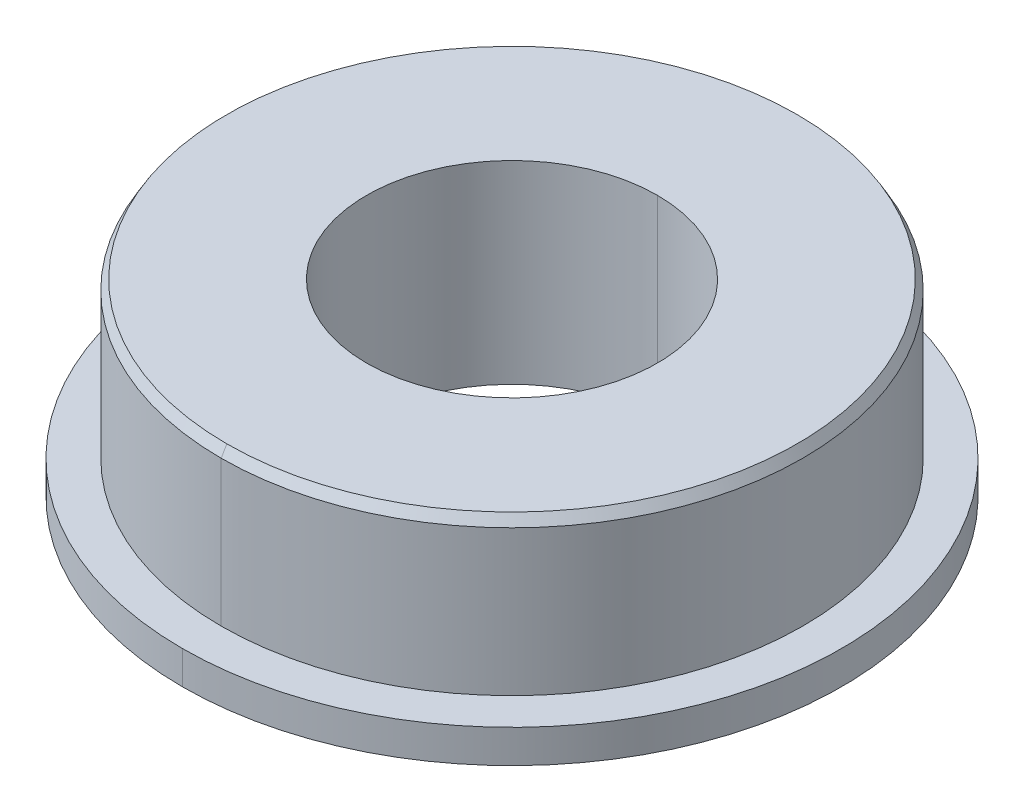
ISO-10303-21;
HEADER;
FILE_DESCRIPTION(('STEP AP214'),'2;1');
FILE_NAME('part.step','',(''),(''),'','','');
FILE_SCHEMA(('AUTOMOTIVE_DESIGN { 1 0 10303 214 1 1 1 1 }'));
ENDSEC;
DATA;
#1=APPLICATION_CONTEXT('core data for automotive mechanical design processes');
#2=APPLICATION_PROTOCOL_DEFINITION('international standard','automotive_design',2000,#1);
#3=PRODUCT_CONTEXT('',#1,'mechanical');
#4=PRODUCT('Part','Part','',(#3));
#5=PRODUCT_RELATED_PRODUCT_CATEGORY('part','',(#4));
#6=PRODUCT_DEFINITION_FORMATION('','',#4);
#7=PRODUCT_DEFINITION_CONTEXT('part definition',#1,'design');
#8=PRODUCT_DEFINITION('design','',#6,#7);
#9=PRODUCT_DEFINITION_SHAPE('','',#8);
#10=(LENGTH_UNIT() NAMED_UNIT(*) SI_UNIT(.MILLI.,.METRE.));
#11=(NAMED_UNIT(*) PLANE_ANGLE_UNIT() SI_UNIT($,.RADIAN.));
#12=(NAMED_UNIT(*) SI_UNIT($,.STERADIAN.) SOLID_ANGLE_UNIT());
#13=UNCERTAINTY_MEASURE_WITH_UNIT(LENGTH_MEASURE(1.E-05),#10,'distance_accuracy_value','');
#14=(GEOMETRIC_REPRESENTATION_CONTEXT(3) GLOBAL_UNCERTAINTY_ASSIGNED_CONTEXT((#13)) GLOBAL_UNIT_ASSIGNED_CONTEXT((#10,
#11,#12)) REPRESENTATION_CONTEXT('',''));
#15=CARTESIAN_POINT('',(0.,0.,0.));
#16=DIRECTION('',(0.,0.,1.));
#17=DIRECTION('',(1.,0.,0.));
#18=AXIS2_PLACEMENT_3D('',#15,#16,#17);
#19=CARTESIAN_POINT('',(0.,4.,0.));
#20=DIRECTION('',(0.,-1.,0.));
#21=DIRECTION('',(0.,0.,-1.));
#22=AXIS2_PLACEMENT_3D('',#19,#20,#21);
#23=CONICAL_SURFACE('',#22,5.88452994616208,0.52359877559829);
#24=DIRECTION('',(0.,-0.866025403784443,0.499999999999992));
#25=VECTOR('',#24,1.);
#26=CARTESIAN_POINT('',(0.,4.,5.88452994616208));
#27=LINE('',#26,#25);
#28=CARTESIAN_POINT('',(0.,4.,5.88452994616208));
#29=VERTEX_POINT('',#28);
#30=CARTESIAN_POINT('',(0.,3.8,6.));
#31=VERTEX_POINT('',#30);
#32=EDGE_CURVE('E147',#29,#31,#27,.T.);
#33=ORIENTED_EDGE('',*,*,#32,.F.);
#34=CARTESIAN_POINT('',(0.,4.,0.));
#35=DIRECTION('',(0.,1.,0.));
#36=DIRECTION('',(0.,0.,1.));
#37=AXIS2_PLACEMENT_3D('',#34,#35,#36);
#38=CIRCLE('',#37,5.88452994616208);
#39=CARTESIAN_POINT('',(0.,4.,-5.88452994616208));
#40=VERTEX_POINT('',#39);
#41=EDGE_CURVE('E110',#40,#29,#38,.T.);
#42=ORIENTED_EDGE('',*,*,#41,.F.);
#43=DIRECTION('',(0.,-0.866025403784443,-0.499999999999992));
#44=VECTOR('',#43,1.);
#45=CARTESIAN_POINT('',(0.,4.,-5.88452994616208));
#46=LINE('',#45,#44);
#47=CARTESIAN_POINT('',(0.,3.8,-6.));
#48=VERTEX_POINT('',#47);
#49=EDGE_CURVE('E149',#40,#48,#46,.T.);
#50=ORIENTED_EDGE('',*,*,#49,.T.);
#51=CARTESIAN_POINT('',(0.,3.8,0.));
#52=DIRECTION('',(0.,-1.,0.));
#53=DIRECTION('',(0.,0.,1.));
#54=AXIS2_PLACEMENT_3D('',#51,#52,#53);
#55=CIRCLE('',#54,6.);
#56=EDGE_CURVE('E111',#31,#48,#55,.T.);
#57=ORIENTED_EDGE('',*,*,#56,.F.);
#58=EDGE_LOOP('',(#33,#42,#50,#57));
#59=FACE_BOUND('',#58,.T.);
#60=ADVANCED_FACE('F16',(#59),#23,.T.);
#61=CARTESIAN_POINT('',(0.,0.115470053837924,0.));
#62=DIRECTION('',(0.,1.,0.));
#63=DIRECTION('',(0.,0.,1.));
#64=AXIS2_PLACEMENT_3D('',#61,#62,#63);
#65=CONICAL_SURFACE('',#64,6.8,1.0471975511966);
#66=DIRECTION('',(0.,0.5,-0.866025403784441));
#67=VECTOR('',#66,1.);
#68=CARTESIAN_POINT('',(0.,0.115470053837924,-6.8));
#69=LINE('',#68,#67);
#70=CARTESIAN_POINT('',(0.,0.,-6.6));
#71=VERTEX_POINT('',#70);
#72=CARTESIAN_POINT('',(0.,0.115470053837924,-6.8));
#73=VERTEX_POINT('',#72);
#74=EDGE_CURVE('E171',#71,#73,#69,.T.);
#75=ORIENTED_EDGE('',*,*,#74,.F.);
#76=CARTESIAN_POINT('',(0.,0.,0.));
#77=DIRECTION('',(0.,-1.,0.));
#78=DIRECTION('',(0.,0.,1.));
#79=AXIS2_PLACEMENT_3D('',#76,#77,#78);
#80=CIRCLE('',#79,6.6);
#81=CARTESIAN_POINT('',(0.,0.,6.6));
#82=VERTEX_POINT('',#81);
#83=EDGE_CURVE('E142',#82,#71,#80,.T.);
#84=ORIENTED_EDGE('',*,*,#83,.F.);
#85=DIRECTION('',(0.,0.5,0.866025403784441));
#86=VECTOR('',#85,1.);
#87=CARTESIAN_POINT('',(0.,0.115470053837924,6.8));
#88=LINE('',#87,#86);
#89=CARTESIAN_POINT('',(0.,0.115470053837924,6.8));
#90=VERTEX_POINT('',#89);
#91=EDGE_CURVE('E155',#82,#90,#88,.T.);
#92=ORIENTED_EDGE('',*,*,#91,.T.);
#93=CARTESIAN_POINT('',(0.,0.115470053837924,0.));
#94=DIRECTION('',(0.,1.,0.));
#95=DIRECTION('',(0.,0.,1.));
#96=AXIS2_PLACEMENT_3D('',#93,#94,#95);
#97=CIRCLE('',#96,6.8);
#98=EDGE_CURVE('E11',#73,#90,#97,.T.);
#99=ORIENTED_EDGE('',*,*,#98,.F.);
#100=EDGE_LOOP('',(#75,#84,#92,#99));
#101=FACE_BOUND('',#100,.T.);
#102=ADVANCED_FACE('F326',(#101),#65,.T.);
#103=CARTESIAN_POINT('',(0.,0.8,0.));
#104=DIRECTION('',(0.,1.,0.));
#105=DIRECTION('',(1.,0.,0.));
#106=AXIS2_PLACEMENT_3D('',#103,#104,#105);
#107=PLANE('',#106);
#108=CARTESIAN_POINT('',(0.,0.8,0.));
#109=DIRECTION('',(0.,1.,0.));
#110=DIRECTION('',(0.,0.,1.));
#111=AXIS2_PLACEMENT_3D('',#108,#109,#110);
#112=CIRCLE('',#111,6.);
#113=CARTESIAN_POINT('',(0.,0.8,-6.));
#114=VERTEX_POINT('',#113);
#115=CARTESIAN_POINT('',(0.,0.8,6.));
#116=VERTEX_POINT('',#115);
#117=EDGE_CURVE('E99',#114,#116,#112,.T.);
#118=ORIENTED_EDGE('',*,*,#117,.F.);
#119=CARTESIAN_POINT('',(0.,0.8,0.));
#120=DIRECTION('',(0.,1.,0.));
#121=DIRECTION('',(0.,0.,1.));
#122=AXIS2_PLACEMENT_3D('',#119,#120,#121);
#123=CIRCLE('',#122,6.);
#124=EDGE_CURVE('E113',#116,#114,#123,.T.);
#125=ORIENTED_EDGE('',*,*,#124,.F.);
#126=EDGE_LOOP('',(#118,#125));
#127=FACE_BOUND('',#126,.T.);
#128=CARTESIAN_POINT('',(0.,0.8,0.));
#129=DIRECTION('',(0.,1.,0.));
#130=DIRECTION('',(0.,0.,1.));
#131=AXIS2_PLACEMENT_3D('',#128,#129,#130);
#132=CIRCLE('',#131,6.8);
#133=CARTESIAN_POINT('',(0.,0.8,-6.8));
#134=VERTEX_POINT('',#133);
#135=CARTESIAN_POINT('',(0.,0.8,6.8));
#136=VERTEX_POINT('',#135);
#137=EDGE_CURVE('E27',#134,#136,#132,.T.);
#138=ORIENTED_EDGE('',*,*,#137,.T.);
#139=CARTESIAN_POINT('',(0.,0.8,0.));
#140=DIRECTION('',(0.,1.,0.));
#141=DIRECTION('',(0.,0.,1.));
#142=AXIS2_PLACEMENT_3D('',#139,#140,#141);
#143=CIRCLE('',#142,6.8);
#144=EDGE_CURVE('E159',#136,#134,#143,.T.);
#145=ORIENTED_EDGE('',*,*,#144,.T.);
#146=EDGE_LOOP('',(#138,#145));
#147=FACE_BOUND('',#146,.T.);
#148=ADVANCED_FACE('F114',(#127,#147),#107,.T.);
#149=CARTESIAN_POINT('',(0.,0.8,0.));
#150=DIRECTION('',(0.,-1.,0.));
#151=DIRECTION('',(0.,0.,-1.));
#152=AXIS2_PLACEMENT_3D('',#149,#150,#151);
#153=CYLINDRICAL_SURFACE('',#152,6.8);
#154=DIRECTION('',(0.,-1.,0.));
#155=VECTOR('',#154,1.);
#156=CARTESIAN_POINT('',(0.,0.8,6.8));
#157=LINE('',#156,#155);
#158=EDGE_CURVE('E132',#136,#90,#157,.T.);
#159=ORIENTED_EDGE('',*,*,#158,.F.);
#160=ORIENTED_EDGE('',*,*,#137,.F.);
#161=DIRECTION('',(0.,-1.,0.));
#162=VECTOR('',#161,1.);
#163=CARTESIAN_POINT('',(0.,0.8,-6.8));
#164=LINE('',#163,#162);
#165=EDGE_CURVE('E124',#134,#73,#164,.T.);
#166=ORIENTED_EDGE('',*,*,#165,.T.);
#167=ORIENTED_EDGE('',*,*,#98,.T.);
#168=EDGE_LOOP('',(#159,#160,#166,#167));
#169=FACE_BOUND('',#168,.T.);
#170=ADVANCED_FACE('F308',(#169),#153,.T.);
#171=CARTESIAN_POINT('',(0.,0.,0.));
#172=DIRECTION('',(0.,1.,0.));
#173=DIRECTION('',(1.,0.,0.));
#174=AXIS2_PLACEMENT_3D('',#171,#172,#173);
#175=PLANE('',#174);
#176=CARTESIAN_POINT('',(0.,0.,0.));
#177=DIRECTION('',(0.,1.,0.));
#178=DIRECTION('',(0.,0.,1.));
#179=AXIS2_PLACEMENT_3D('',#176,#177,#178);
#180=CIRCLE('',#179,3.);
#181=CARTESIAN_POINT('',(0.,0.,-3.));
#182=VERTEX_POINT('',#181);
#183=CARTESIAN_POINT('',(0.,0.,3.));
#184=VERTEX_POINT('',#183);
#185=EDGE_CURVE('E136',#182,#184,#180,.T.);
#186=ORIENTED_EDGE('',*,*,#185,.T.);
#187=CARTESIAN_POINT('',(0.,0.,0.));
#188=DIRECTION('',(0.,1.,0.));
#189=DIRECTION('',(0.,0.,1.));
#190=AXIS2_PLACEMENT_3D('',#187,#188,#189);
#191=CIRCLE('',#190,3.);
#192=EDGE_CURVE('E41',#184,#182,#191,.T.);
#193=ORIENTED_EDGE('',*,*,#192,.T.);
#194=EDGE_LOOP('',(#186,#193));
#195=FACE_BOUND('',#194,.T.);
#196=ORIENTED_EDGE('',*,*,#83,.T.);
#197=CARTESIAN_POINT('',(0.,0.,0.));
#198=DIRECTION('',(0.,-1.,0.));
#199=DIRECTION('',(0.,0.,1.));
#200=AXIS2_PLACEMENT_3D('',#197,#198,#199);
#201=CIRCLE('',#200,6.6);
#202=EDGE_CURVE('E167',#71,#82,#201,.T.);
#203=ORIENTED_EDGE('',*,*,#202,.T.);
#204=EDGE_LOOP('',(#196,#203));
#205=FACE_BOUND('',#204,.T.);
#206=ADVANCED_FACE('F293',(#195,#205),#175,.F.);
#207=CARTESIAN_POINT('',(0.,4.,0.));
#208=DIRECTION('',(0.,1.,0.));
#209=DIRECTION('',(1.,0.,0.));
#210=AXIS2_PLACEMENT_3D('',#207,#208,#209);
#211=PLANE('',#210);
#212=CARTESIAN_POINT('',(0.,4.,0.));
#213=DIRECTION('',(0.,1.,0.));
#214=DIRECTION('',(0.,0.,1.));
#215=AXIS2_PLACEMENT_3D('',#212,#213,#214);
#216=CIRCLE('',#215,3.);
#217=CARTESIAN_POINT('',(0.,4.,-3.));
#218=VERTEX_POINT('',#217);
#219=CARTESIAN_POINT('',(0.,4.,3.));
#220=VERTEX_POINT('',#219);
#221=EDGE_CURVE('E20',#218,#220,#216,.T.);
#222=ORIENTED_EDGE('',*,*,#221,.F.);
#223=CARTESIAN_POINT('',(0.,4.,0.));
#224=DIRECTION('',(0.,1.,0.));
#225=DIRECTION('',(0.,0.,1.));
#226=AXIS2_PLACEMENT_3D('',#223,#224,#225);
#227=CIRCLE('',#226,3.);
#228=EDGE_CURVE('E163',#220,#218,#227,.T.);
#229=ORIENTED_EDGE('',*,*,#228,.F.);
#230=EDGE_LOOP('',(#222,#229));
#231=FACE_BOUND('',#230,.T.);
#232=ORIENTED_EDGE('',*,*,#41,.T.);
#233=CARTESIAN_POINT('',(0.,4.,0.));
#234=DIRECTION('',(0.,1.,0.));
#235=DIRECTION('',(0.,0.,1.));
#236=AXIS2_PLACEMENT_3D('',#233,#234,#235);
#237=CIRCLE('',#236,5.88452994616208);
#238=EDGE_CURVE('E143',#29,#40,#237,.T.);
#239=ORIENTED_EDGE('',*,*,#238,.T.);
#240=EDGE_LOOP('',(#232,#239));
#241=FACE_BOUND('',#240,.T.);
#242=ADVANCED_FACE('F18',(#231,#241),#211,.T.);
#243=CARTESIAN_POINT('',(0.,4.,0.));
#244=DIRECTION('',(0.,-1.,0.));
#245=DIRECTION('',(0.,0.,-1.));
#246=AXIS2_PLACEMENT_3D('',#243,#244,#245);
#247=CYLINDRICAL_SURFACE('',#246,6.);
#248=DIRECTION('',(0.,-1.,0.));
#249=VECTOR('',#248,1.);
#250=CARTESIAN_POINT('',(0.,4.,6.));
#251=LINE('',#250,#249);
#252=EDGE_CURVE('E103',#31,#116,#251,.T.);
#253=ORIENTED_EDGE('',*,*,#252,.F.);
#254=ORIENTED_EDGE('',*,*,#56,.T.);
#255=DIRECTION('',(0.,-1.,0.));
#256=VECTOR('',#255,1.);
#257=CARTESIAN_POINT('',(0.,4.,-6.));
#258=LINE('',#257,#256);
#259=EDGE_CURVE('E106',#48,#114,#258,.T.);
#260=ORIENTED_EDGE('',*,*,#259,.T.);
#261=ORIENTED_EDGE('',*,*,#117,.T.);
#262=EDGE_LOOP('',(#253,#254,#260,#261));
#263=FACE_BOUND('',#262,.T.);
#264=ADVANCED_FACE('F101',(#263),#247,.T.);
#265=CARTESIAN_POINT('',(0.,4.,0.));
#266=DIRECTION('',(0.,-1.,0.));
#267=DIRECTION('',(0.,0.,-1.));
#268=AXIS2_PLACEMENT_3D('',#265,#266,#267);
#269=CYLINDRICAL_SURFACE('',#268,3.);
#270=DIRECTION('',(0.,-1.,0.));
#271=VECTOR('',#270,1.);
#272=CARTESIAN_POINT('',(0.,4.,3.));
#273=LINE('',#272,#271);
#274=EDGE_CURVE('E139',#220,#184,#273,.T.);
#275=ORIENTED_EDGE('',*,*,#274,.F.);
#276=ORIENTED_EDGE('',*,*,#228,.T.);
#277=DIRECTION('',(0.,-1.,0.));
#278=VECTOR('',#277,1.);
#279=CARTESIAN_POINT('',(0.,4.,-3.));
#280=LINE('',#279,#278);
#281=EDGE_CURVE('E138',#218,#182,#280,.T.);
#282=ORIENTED_EDGE('',*,*,#281,.T.);
#283=ORIENTED_EDGE('',*,*,#192,.F.);
#284=EDGE_LOOP('',(#275,#276,#282,#283));
#285=FACE_BOUND('',#284,.T.);
#286=ADVANCED_FACE('F301',(#285),#269,.F.);
#287=CARTESIAN_POINT('',(0.,4.,0.));
#288=DIRECTION('',(0.,-1.,0.));
#289=DIRECTION('',(0.,0.,-1.));
#290=AXIS2_PLACEMENT_3D('',#287,#288,#289);
#291=CYLINDRICAL_SURFACE('',#290,3.);
#292=ORIENTED_EDGE('',*,*,#221,.T.);
#293=ORIENTED_EDGE('',*,*,#274,.T.);
#294=ORIENTED_EDGE('',*,*,#185,.F.);
#295=ORIENTED_EDGE('',*,*,#281,.F.);
#296=EDGE_LOOP('',(#292,#293,#294,#295));
#297=FACE_BOUND('',#296,.T.);
#298=ADVANCED_FACE('F358',(#297),#291,.F.);
#299=CARTESIAN_POINT('',(0.,4.,0.));
#300=DIRECTION('',(0.,-1.,0.));
#301=DIRECTION('',(0.,0.,-1.));
#302=AXIS2_PLACEMENT_3D('',#299,#300,#301);
#303=CYLINDRICAL_SURFACE('',#302,6.);
#304=CARTESIAN_POINT('',(0.,3.8,0.));
#305=DIRECTION('',(0.,-1.,0.));
#306=DIRECTION('',(0.,0.,1.));
#307=AXIS2_PLACEMENT_3D('',#304,#305,#306);
#308=CIRCLE('',#307,6.);
#309=EDGE_CURVE('E121',#48,#31,#308,.T.);
#310=ORIENTED_EDGE('',*,*,#309,.T.);
#311=ORIENTED_EDGE('',*,*,#252,.T.);
#312=ORIENTED_EDGE('',*,*,#124,.T.);
#313=ORIENTED_EDGE('',*,*,#259,.F.);
#314=EDGE_LOOP('',(#310,#311,#312,#313));
#315=FACE_BOUND('',#314,.T.);
#316=ADVANCED_FACE('F119',(#315),#303,.T.);
#317=CARTESIAN_POINT('',(0.,0.8,0.));
#318=DIRECTION('',(0.,-1.,0.));
#319=DIRECTION('',(0.,0.,-1.));
#320=AXIS2_PLACEMENT_3D('',#317,#318,#319);
#321=CYLINDRICAL_SURFACE('',#320,6.8);
#322=ORIENTED_EDGE('',*,*,#144,.F.);
#323=ORIENTED_EDGE('',*,*,#158,.T.);
#324=CARTESIAN_POINT('',(0.,0.115470053837924,0.));
#325=DIRECTION('',(0.,1.,0.));
#326=DIRECTION('',(0.,0.,1.));
#327=AXIS2_PLACEMENT_3D('',#324,#325,#326);
#328=CIRCLE('',#327,6.8);
#329=EDGE_CURVE('E160',#90,#73,#328,.T.);
#330=ORIENTED_EDGE('',*,*,#329,.T.);
#331=ORIENTED_EDGE('',*,*,#165,.F.);
#332=EDGE_LOOP('',(#322,#323,#330,#331));
#333=FACE_BOUND('',#332,.T.);
#334=ADVANCED_FACE('F313',(#333),#321,.T.);
#335=CARTESIAN_POINT('',(0.,0.115470053837924,0.));
#336=DIRECTION('',(0.,1.,0.));
#337=DIRECTION('',(0.,0.,1.));
#338=AXIS2_PLACEMENT_3D('',#335,#336,#337);
#339=CONICAL_SURFACE('',#338,6.8,1.0471975511966);
#340=ORIENTED_EDGE('',*,*,#202,.F.);
#341=ORIENTED_EDGE('',*,*,#74,.T.);
#342=ORIENTED_EDGE('',*,*,#329,.F.);
#343=ORIENTED_EDGE('',*,*,#91,.F.);
#344=EDGE_LOOP('',(#340,#341,#342,#343));
#345=FACE_BOUND('',#344,.T.);
#346=ADVANCED_FACE('F317',(#345),#339,.T.);
#347=CARTESIAN_POINT('',(0.,4.,0.));
#348=DIRECTION('',(0.,-1.,0.));
#349=DIRECTION('',(0.,0.,-1.));
#350=AXIS2_PLACEMENT_3D('',#347,#348,#349);
#351=CONICAL_SURFACE('',#350,5.88452994616208,0.52359877559829);
#352=ORIENTED_EDGE('',*,*,#238,.F.);
#353=ORIENTED_EDGE('',*,*,#32,.T.);
#354=ORIENTED_EDGE('',*,*,#309,.F.);
#355=ORIENTED_EDGE('',*,*,#49,.F.);
#356=EDGE_LOOP('',(#352,#353,#354,#355));
#357=FACE_BOUND('',#356,.T.);
#358=ADVANCED_FACE('F187',(#357),#351,.T.);
#359=CLOSED_SHELL('',(#60,#102,#148,#170,#206,#242,#264,#286,#298,#316,#334,#346,#358));
#360=MANIFOLD_SOLID_BREP('B1',#359);
#361=ADVANCED_BREP_SHAPE_REPRESENTATION('',(#18,#360),#14);
#362=SHAPE_DEFINITION_REPRESENTATION(#9,#361);
ENDSEC;
END-ISO-10303-21;
